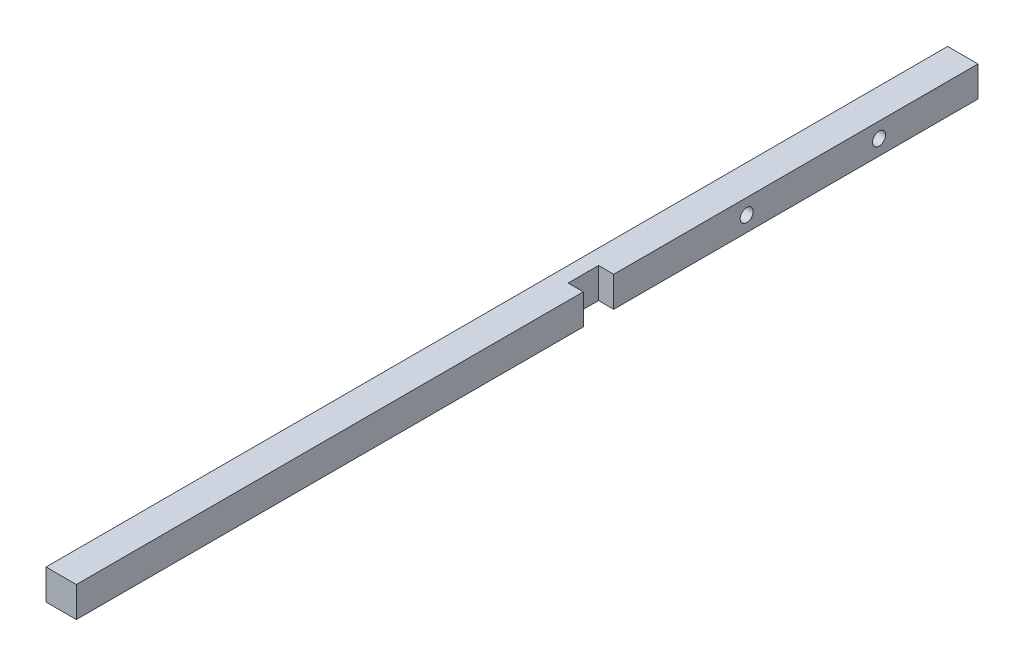
ISO-10303-21;
HEADER;
FILE_DESCRIPTION(('STEP AP214'),'2;1');
FILE_NAME('part.step','',(''),(''),'','','');
FILE_SCHEMA(('AUTOMOTIVE_DESIGN { 1 0 10303 214 1 1 1 1 }'));
ENDSEC;
DATA;
#1=APPLICATION_CONTEXT('core data for automotive mechanical design processes');
#2=APPLICATION_PROTOCOL_DEFINITION('international standard','automotive_design',2000,#1);
#3=PRODUCT_CONTEXT('',#1,'mechanical');
#4=PRODUCT('Part','Part','',(#3));
#5=PRODUCT_RELATED_PRODUCT_CATEGORY('part','',(#4));
#6=PRODUCT_DEFINITION_FORMATION('','',#4);
#7=PRODUCT_DEFINITION_CONTEXT('part definition',#1,'design');
#8=PRODUCT_DEFINITION('design','',#6,#7);
#9=PRODUCT_DEFINITION_SHAPE('','',#8);
#10=(LENGTH_UNIT() NAMED_UNIT(*) SI_UNIT(.MILLI.,.METRE.));
#11=(NAMED_UNIT(*) PLANE_ANGLE_UNIT() SI_UNIT($,.RADIAN.));
#12=(NAMED_UNIT(*) SI_UNIT($,.STERADIAN.) SOLID_ANGLE_UNIT());
#13=UNCERTAINTY_MEASURE_WITH_UNIT(LENGTH_MEASURE(1.E-05),#10,'distance_accuracy_value','');
#14=(GEOMETRIC_REPRESENTATION_CONTEXT(3) GLOBAL_UNCERTAINTY_ASSIGNED_CONTEXT((#13)) GLOBAL_UNIT_ASSIGNED_CONTEXT((#10,
#11,#12)) REPRESENTATION_CONTEXT('',''));
#15=CARTESIAN_POINT('',(0.,0.,0.));
#16=DIRECTION('',(0.,0.,1.));
#17=DIRECTION('',(1.,0.,0.));
#18=AXIS2_PLACEMENT_3D('',#15,#16,#17);
#19=CARTESIAN_POINT('',(5.,5.,323.142135623731));
#20=DIRECTION('',(-1.,0.,0.));
#21=DIRECTION('',(0.,-1.,0.));
#22=AXIS2_PLACEMENT_3D('',#19,#20,#21);
#23=PLANE('',#22);
#24=DIRECTION('',(0.,0.,-1.));
#25=VECTOR('',#24,1.);
#26=CARTESIAN_POINT('',(5.,-5.,323.142135623731));
#27=LINE('',#26,#25);
#28=CARTESIAN_POINT('',(5.,-5.,307.));
#29=VERTEX_POINT('',#28);
#30=CARTESIAN_POINT('',(5.,-5.,140.));
#31=VERTEX_POINT('',#30);
#32=EDGE_CURVE('E163',#29,#31,#27,.T.);
#33=ORIENTED_EDGE('',*,*,#32,.T.);
#34=DIRECTION('',(0.,-1.,0.));
#35=VECTOR('',#34,1.);
#36=CARTESIAN_POINT('',(5.,5.,140.));
#37=LINE('',#36,#35);
#38=CARTESIAN_POINT('',(5.,5.,140.));
#39=VERTEX_POINT('',#38);
#40=EDGE_CURVE('E139',#39,#31,#37,.T.);
#41=ORIENTED_EDGE('',*,*,#40,.F.);
#42=DIRECTION('',(0.,0.,-1.));
#43=VECTOR('',#42,1.);
#44=CARTESIAN_POINT('',(5.,5.,323.142135623731));
#45=LINE('',#44,#43);
#46=CARTESIAN_POINT('',(5.,5.,307.));
#47=VERTEX_POINT('',#46);
#48=EDGE_CURVE('E158',#47,#39,#45,.T.);
#49=ORIENTED_EDGE('',*,*,#48,.F.);
#50=DIRECTION('',(0.,1.,0.));
#51=VECTOR('',#50,1.);
#52=CARTESIAN_POINT('',(5.,5.,307.));
#53=LINE('',#52,#51);
#54=EDGE_CURVE('E12',#29,#47,#53,.T.);
#55=ORIENTED_EDGE('',*,*,#54,.F.);
#56=EDGE_LOOP('',(#33,#41,#49,#55));
#57=FACE_BOUND('',#56,.T.);
#58=ADVANCED_FACE('F38',(#57),#23,.F.);
#59=CARTESIAN_POINT('',(-5.,5.,323.142135623731));
#60=DIRECTION('',(1.,0.,0.));
#61=DIRECTION('',(0.,1.,0.));
#62=AXIS2_PLACEMENT_3D('',#59,#60,#61);
#63=PLANE('',#62);
#64=CARTESIAN_POINT('',(-5.,0.,86.1864829275686));
#65=DIRECTION('',(-1.,0.,0.));
#66=DIRECTION('',(0.,0.,1.));
#67=AXIS2_PLACEMENT_3D('',#64,#65,#66);
#68=CIRCLE('',#67,2.14999999999999);
#69=CARTESIAN_POINT('',(-5.,0.,88.3364829275686));
#70=VERTEX_POINT('',#69);
#71=EDGE_CURVE('E221',#70,#70,#68,.T.);
#72=ORIENTED_EDGE('',*,*,#71,.F.);
#73=EDGE_LOOP('',(#72));
#74=FACE_BOUND('',#73,.T.);
#75=CARTESIAN_POINT('',(-5.,0.,42.5864829275686));
#76=DIRECTION('',(-1.,0.,0.));
#77=DIRECTION('',(0.,0.,1.));
#78=AXIS2_PLACEMENT_3D('',#75,#76,#77);
#79=CIRCLE('',#78,2.14999999999999);
#80=CARTESIAN_POINT('',(-5.,0.,44.7364829275686));
#81=VERTEX_POINT('',#80);
#82=EDGE_CURVE('E217',#81,#81,#79,.T.);
#83=ORIENTED_EDGE('',*,*,#82,.F.);
#84=EDGE_LOOP('',(#83));
#85=FACE_BOUND('',#84,.T.);
#86=DIRECTION('',(0.,0.,-1.));
#87=VECTOR('',#86,1.);
#88=CARTESIAN_POINT('',(-5.,5.,323.142135623731));
#89=LINE('',#88,#87);
#90=CARTESIAN_POINT('',(-5.,5.,307.));
#91=VERTEX_POINT('',#90);
#92=CARTESIAN_POINT('',(-5.,5.,10.0000000000001));
#93=VERTEX_POINT('',#92);
#94=EDGE_CURVE('E42',#91,#93,#89,.T.);
#95=ORIENTED_EDGE('',*,*,#94,.T.);
#96=DIRECTION('',(0.,1.,0.));
#97=VECTOR('',#96,1.);
#98=CARTESIAN_POINT('',(-5.,-5.,10.));
#99=LINE('',#98,#97);
#100=CARTESIAN_POINT('',(-5.,-5.,10.));
#101=VERTEX_POINT('',#100);
#102=EDGE_CURVE('E63',#101,#93,#99,.T.);
#103=ORIENTED_EDGE('',*,*,#102,.F.);
#104=DIRECTION('',(0.,0.,-1.));
#105=VECTOR('',#104,1.);
#106=CARTESIAN_POINT('',(-5.,-5.,323.142135623731));
#107=LINE('',#106,#105);
#108=CARTESIAN_POINT('',(-5.,-5.,307.));
#109=VERTEX_POINT('',#108);
#110=EDGE_CURVE('E159',#109,#101,#107,.T.);
#111=ORIENTED_EDGE('',*,*,#110,.F.);
#112=DIRECTION('',(0.,-1.,0.));
#113=VECTOR('',#112,1.);
#114=CARTESIAN_POINT('',(-5.,5.,307.));
#115=LINE('',#114,#113);
#116=EDGE_CURVE('E152',#91,#109,#115,.T.);
#117=ORIENTED_EDGE('',*,*,#116,.F.);
#118=EDGE_LOOP('',(#95,#103,#111,#117));
#119=FACE_BOUND('',#118,.T.);
#120=ADVANCED_FACE('F177',(#74,#85,#119),#63,.F.);
#121=CARTESIAN_POINT('',(-5.,-5.,323.142135623731));
#122=DIRECTION('',(0.,1.,0.));
#123=DIRECTION('',(0.,0.,1.));
#124=AXIS2_PLACEMENT_3D('',#121,#122,#123);
#125=PLANE('',#124);
#126=DIRECTION('',(0.,0.,-1.));
#127=VECTOR('',#126,1.);
#128=CARTESIAN_POINT('',(0.,-5.,130.));
#129=LINE('',#128,#127);
#130=CARTESIAN_POINT('',(0.,-5.,140.));
#131=VERTEX_POINT('',#130);
#132=CARTESIAN_POINT('',(0.,-5.,130.));
#133=VERTEX_POINT('',#132);
#134=EDGE_CURVE('E113',#131,#133,#129,.T.);
#135=ORIENTED_EDGE('',*,*,#134,.F.);
#136=DIRECTION('',(-1.,0.,0.));
#137=VECTOR('',#136,1.);
#138=CARTESIAN_POINT('',(0.,-5.,140.));
#139=LINE('',#138,#137);
#140=EDGE_CURVE('E124',#31,#131,#139,.T.);
#141=ORIENTED_EDGE('',*,*,#140,.F.);
#142=ORIENTED_EDGE('',*,*,#32,.F.);
#143=DIRECTION('',(1.,0.,0.));
#144=VECTOR('',#143,1.);
#145=CARTESIAN_POINT('',(-5.,-5.,307.));
#146=LINE('',#145,#144);
#147=EDGE_CURVE('E47',#109,#29,#146,.T.);
#148=ORIENTED_EDGE('',*,*,#147,.F.);
#149=ORIENTED_EDGE('',*,*,#110,.T.);
#150=DIRECTION('',(1.,0.,0.));
#151=VECTOR('',#150,1.);
#152=CARTESIAN_POINT('',(-5.,-5.,10.));
#153=LINE('',#152,#151);
#154=CARTESIAN_POINT('',(5.,-5.,10.));
#155=VERTEX_POINT('',#154);
#156=EDGE_CURVE('E143',#101,#155,#153,.T.);
#157=ORIENTED_EDGE('',*,*,#156,.T.);
#158=CARTESIAN_POINT('',(5.,-5.,130.));
#159=VERTEX_POINT('',#158);
#160=EDGE_CURVE('E162',#159,#155,#27,.T.);
#161=ORIENTED_EDGE('',*,*,#160,.F.);
#162=DIRECTION('',(1.,0.,0.));
#163=VECTOR('',#162,1.);
#164=CARTESIAN_POINT('',(0.,-5.,130.));
#165=LINE('',#164,#163);
#166=EDGE_CURVE('E127',#133,#159,#165,.T.);
#167=ORIENTED_EDGE('',*,*,#166,.F.);
#168=EDGE_LOOP('',(#135,#141,#142,#148,#149,#157,#161,#167));
#169=FACE_BOUND('',#168,.T.);
#170=ADVANCED_FACE('F174',(#169),#125,.F.);
#171=CARTESIAN_POINT('',(5.,0.,86.1864829275686));
#172=DIRECTION('',(-1.,0.,0.));
#173=DIRECTION('',(0.,0.,1.));
#174=AXIS2_PLACEMENT_3D('',#171,#172,#173);
#175=CIRCLE('',#174,2.15);
#176=CARTESIAN_POINT('',(5.,0.,88.3364829275686));
#177=VERTEX_POINT('',#176);
#178=EDGE_CURVE('E213',#177,#177,#175,.T.);
#179=ORIENTED_EDGE('',*,*,#178,.T.);
#180=EDGE_LOOP('',(#179));
#181=FACE_BOUND('',#180,.T.);
#182=CARTESIAN_POINT('',(5.,0.,42.5864829275686));
#183=DIRECTION('',(-1.,0.,0.));
#184=DIRECTION('',(0.,0.,1.));
#185=AXIS2_PLACEMENT_3D('',#182,#183,#184);
#186=CIRCLE('',#185,2.15);
#187=CARTESIAN_POINT('',(5.,0.,44.7364829275686));
#188=VERTEX_POINT('',#187);
#189=EDGE_CURVE('E130',#188,#188,#186,.T.);
#190=ORIENTED_EDGE('',*,*,#189,.T.);
#191=EDGE_LOOP('',(#190));
#192=FACE_BOUND('',#191,.T.);
#193=CARTESIAN_POINT('',(5.,5.,130.));
#194=VERTEX_POINT('',#193);
#195=CARTESIAN_POINT('',(5.,5.,10.));
#196=VERTEX_POINT('',#195);
#197=EDGE_CURVE('E165',#194,#196,#45,.T.);
#198=ORIENTED_EDGE('',*,*,#197,.F.);
#199=DIRECTION('',(0.,-1.,0.));
#200=VECTOR('',#199,1.);
#201=CARTESIAN_POINT('',(5.,5.,130.));
#202=LINE('',#201,#200);
#203=EDGE_CURVE('E55',#194,#159,#202,.T.);
#204=ORIENTED_EDGE('',*,*,#203,.T.);
#205=ORIENTED_EDGE('',*,*,#160,.T.);
#206=DIRECTION('',(0.,1.,0.));
#207=VECTOR('',#206,1.);
#208=CARTESIAN_POINT('',(5.,-5.,10.));
#209=LINE('',#208,#207);
#210=EDGE_CURVE('E146',#155,#196,#209,.T.);
#211=ORIENTED_EDGE('',*,*,#210,.T.);
#212=EDGE_LOOP('',(#198,#204,#205,#211));
#213=FACE_BOUND('',#212,.T.);
#214=ADVANCED_FACE('F171',(#181,#192,#213),#23,.F.);
#215=CARTESIAN_POINT('',(-5.,5.,323.142135623731));
#216=DIRECTION('',(0.,-1.,0.));
#217=DIRECTION('',(0.,0.,-1.));
#218=AXIS2_PLACEMENT_3D('',#215,#216,#217);
#219=PLANE('',#218);
#220=ORIENTED_EDGE('',*,*,#48,.T.);
#221=DIRECTION('',(-1.,0.,0.));
#222=VECTOR('',#221,1.);
#223=CARTESIAN_POINT('',(0.,5.,140.));
#224=LINE('',#223,#222);
#225=CARTESIAN_POINT('',(0.,5.,140.));
#226=VERTEX_POINT('',#225);
#227=EDGE_CURVE('E115',#39,#226,#224,.T.);
#228=ORIENTED_EDGE('',*,*,#227,.T.);
#229=DIRECTION('',(0.,0.,-1.));
#230=VECTOR('',#229,1.);
#231=CARTESIAN_POINT('',(0.,5.,130.));
#232=LINE('',#231,#230);
#233=CARTESIAN_POINT('',(0.,5.,130.));
#234=VERTEX_POINT('',#233);
#235=EDGE_CURVE('E110',#226,#234,#232,.T.);
#236=ORIENTED_EDGE('',*,*,#235,.T.);
#237=DIRECTION('',(1.,0.,0.));
#238=VECTOR('',#237,1.);
#239=CARTESIAN_POINT('',(0.,5.,130.));
#240=LINE('',#239,#238);
#241=EDGE_CURVE('E117',#234,#194,#240,.T.);
#242=ORIENTED_EDGE('',*,*,#241,.T.);
#243=ORIENTED_EDGE('',*,*,#197,.T.);
#244=DIRECTION('',(1.,0.,0.));
#245=VECTOR('',#244,1.);
#246=CARTESIAN_POINT('',(-5.,5.,10.));
#247=LINE('',#246,#245);
#248=EDGE_CURVE('E138',#93,#196,#247,.T.);
#249=ORIENTED_EDGE('',*,*,#248,.F.);
#250=ORIENTED_EDGE('',*,*,#94,.F.);
#251=DIRECTION('',(-1.,0.,0.));
#252=VECTOR('',#251,1.);
#253=CARTESIAN_POINT('',(-5.,5.,307.));
#254=LINE('',#253,#252);
#255=EDGE_CURVE('E155',#47,#91,#254,.T.);
#256=ORIENTED_EDGE('',*,*,#255,.F.);
#257=EDGE_LOOP('',(#220,#228,#236,#242,#243,#249,#250,#256));
#258=FACE_BOUND('',#257,.T.);
#259=ADVANCED_FACE('F123',(#258),#219,.F.);
#260=CARTESIAN_POINT('',(5.00000000000001,107.407016268671,307.));
#261=DIRECTION('',(0.,0.,1.));
#262=DIRECTION('',(0.,1.,0.));
#263=AXIS2_PLACEMENT_3D('',#260,#261,#262);
#264=PLANE('',#263);
#265=ORIENTED_EDGE('',*,*,#255,.T.);
#266=ORIENTED_EDGE('',*,*,#116,.T.);
#267=ORIENTED_EDGE('',*,*,#147,.T.);
#268=ORIENTED_EDGE('',*,*,#54,.T.);
#269=EDGE_LOOP('',(#265,#266,#267,#268));
#270=FACE_BOUND('',#269,.T.);
#271=ADVANCED_FACE('F40',(#270),#264,.T.);
#272=CARTESIAN_POINT('',(-5.,-5.,10.));
#273=DIRECTION('',(0.,0.,1.));
#274=DIRECTION('',(1.,0.,0.));
#275=AXIS2_PLACEMENT_3D('',#272,#273,#274);
#276=PLANE('',#275);
#277=CARTESIAN_POINT('',(0.,0.,10.));
#278=DIRECTION('',(0.,0.,-1.));
#279=DIRECTION('',(-1.,0.,0.));
#280=AXIS2_PLACEMENT_3D('',#277,#278,#279);
#281=CIRCLE('',#280,1.24999999999999);
#282=CARTESIAN_POINT('',(-1.24999999999999,0.,10.));
#283=VERTEX_POINT('',#282);
#284=EDGE_CURVE('E229',#283,#283,#281,.T.);
#285=ORIENTED_EDGE('',*,*,#284,.F.);
#286=EDGE_LOOP('',(#285));
#287=FACE_BOUND('',#286,.T.);
#288=ORIENTED_EDGE('',*,*,#210,.F.);
#289=ORIENTED_EDGE('',*,*,#156,.F.);
#290=ORIENTED_EDGE('',*,*,#102,.T.);
#291=ORIENTED_EDGE('',*,*,#248,.T.);
#292=EDGE_LOOP('',(#288,#289,#290,#291));
#293=FACE_BOUND('',#292,.T.);
#294=ADVANCED_FACE('F170',(#287,#293),#276,.F.);
#295=CARTESIAN_POINT('',(0.,5.,130.));
#296=DIRECTION('',(-1.,0.,0.));
#297=DIRECTION('',(0.,0.,1.));
#298=AXIS2_PLACEMENT_3D('',#295,#296,#297);
#299=PLANE('',#298);
#300=ORIENTED_EDGE('',*,*,#134,.T.);
#301=DIRECTION('',(0.,-1.,0.));
#302=VECTOR('',#301,1.);
#303=CARTESIAN_POINT('',(0.,5.,130.));
#304=LINE('',#303,#302);
#305=EDGE_CURVE('E107',#234,#133,#304,.T.);
#306=ORIENTED_EDGE('',*,*,#305,.F.);
#307=ORIENTED_EDGE('',*,*,#235,.F.);
#308=DIRECTION('',(0.,-1.,0.));
#309=VECTOR('',#308,1.);
#310=CARTESIAN_POINT('',(0.,5.,140.));
#311=LINE('',#310,#309);
#312=EDGE_CURVE('E136',#226,#131,#311,.T.);
#313=ORIENTED_EDGE('',*,*,#312,.T.);
#314=EDGE_LOOP('',(#300,#306,#307,#313));
#315=FACE_BOUND('',#314,.T.);
#316=ADVANCED_FACE('F108',(#315),#299,.F.);
#317=CARTESIAN_POINT('',(0.,5.,140.));
#318=DIRECTION('',(0.,0.,1.));
#319=DIRECTION('',(1.,0.,0.));
#320=AXIS2_PLACEMENT_3D('',#317,#318,#319);
#321=PLANE('',#320);
#322=ORIENTED_EDGE('',*,*,#140,.T.);
#323=ORIENTED_EDGE('',*,*,#312,.F.);
#324=ORIENTED_EDGE('',*,*,#227,.F.);
#325=ORIENTED_EDGE('',*,*,#40,.T.);
#326=EDGE_LOOP('',(#322,#323,#324,#325));
#327=FACE_BOUND('',#326,.T.);
#328=ADVANCED_FACE('F185',(#327),#321,.F.);
#329=CARTESIAN_POINT('',(0.,5.,130.));
#330=DIRECTION('',(0.,0.,-1.));
#331=DIRECTION('',(-1.,0.,0.));
#332=AXIS2_PLACEMENT_3D('',#329,#330,#331);
#333=PLANE('',#332);
#334=ORIENTED_EDGE('',*,*,#166,.T.);
#335=ORIENTED_EDGE('',*,*,#203,.F.);
#336=ORIENTED_EDGE('',*,*,#241,.F.);
#337=ORIENTED_EDGE('',*,*,#305,.T.);
#338=EDGE_LOOP('',(#334,#335,#336,#337));
#339=FACE_BOUND('',#338,.T.);
#340=ADVANCED_FACE('F118',(#339),#333,.F.);
#341=CARTESIAN_POINT('',(-5.,0.,42.5864829275686));
#342=DIRECTION('',(-1.,0.,0.));
#343=DIRECTION('',(0.,0.,1.));
#344=AXIS2_PLACEMENT_3D('',#341,#342,#343);
#345=CYLINDRICAL_SURFACE('',#344,2.14999999999999);
#346=ORIENTED_EDGE('',*,*,#189,.F.);
#347=EDGE_LOOP('',(#346));
#348=FACE_BOUND('',#347,.T.);
#349=ORIENTED_EDGE('',*,*,#82,.T.);
#350=EDGE_LOOP('',(#349));
#351=FACE_BOUND('',#350,.T.);
#352=ADVANCED_FACE('F192',(#348,#351),#345,.F.);
#353=CARTESIAN_POINT('',(-5.,0.,86.1864829275686));
#354=DIRECTION('',(-1.,0.,0.));
#355=DIRECTION('',(0.,0.,1.));
#356=AXIS2_PLACEMENT_3D('',#353,#354,#355);
#357=CYLINDRICAL_SURFACE('',#356,2.14999999999999);
#358=ORIENTED_EDGE('',*,*,#178,.F.);
#359=EDGE_LOOP('',(#358));
#360=FACE_BOUND('',#359,.T.);
#361=ORIENTED_EDGE('',*,*,#71,.T.);
#362=EDGE_LOOP('',(#361));
#363=FACE_BOUND('',#362,.T.);
#364=ADVANCED_FACE('F285',(#360,#363),#357,.F.);
#365=CARTESIAN_POINT('',(0.,0.,18.5));
#366=DIRECTION('',(0.,0.,1.));
#367=DIRECTION('',(1.,0.,0.));
#368=AXIS2_PLACEMENT_3D('',#365,#366,#367);
#369=PLANE('',#368);
#370=CARTESIAN_POINT('',(0.,0.,18.5));
#371=DIRECTION('',(0.,0.,-1.));
#372=DIRECTION('',(-1.,0.,0.));
#373=AXIS2_PLACEMENT_3D('',#370,#371,#372);
#374=CIRCLE('',#373,1.24999999999999);
#375=CARTESIAN_POINT('',(-1.24999999999999,0.,18.5));
#376=VERTEX_POINT('',#375);
#377=EDGE_CURVE('E226',#376,#376,#374,.T.);
#378=ORIENTED_EDGE('',*,*,#377,.T.);
#379=EDGE_LOOP('',(#378));
#380=FACE_BOUND('',#379,.T.);
#381=ADVANCED_FACE('F292',(#380),#369,.F.);
#382=CARTESIAN_POINT('',(0.,0.,10.));
#383=DIRECTION('',(0.,0.,-1.));
#384=DIRECTION('',(-1.,0.,0.));
#385=AXIS2_PLACEMENT_3D('',#382,#383,#384);
#386=CYLINDRICAL_SURFACE('',#385,1.24999999999999);
#387=ORIENTED_EDGE('',*,*,#377,.F.);
#388=EDGE_LOOP('',(#387));
#389=FACE_BOUND('',#388,.T.);
#390=ORIENTED_EDGE('',*,*,#284,.T.);
#391=EDGE_LOOP('',(#390));
#392=FACE_BOUND('',#391,.T.);
#393=ADVANCED_FACE('F233',(#389,#392),#386,.F.);
#394=CLOSED_SHELL('',(#58,#120,#170,#214,#259,#271,#294,#316,#328,#340,#352,#364,#381,#393));
#395=MANIFOLD_SOLID_BREP('B2',#394);
#396=ADVANCED_BREP_SHAPE_REPRESENTATION('',(#18,#395),#14);
#397=SHAPE_DEFINITION_REPRESENTATION(#9,#396);
ENDSEC;
END-ISO-10303-21;
